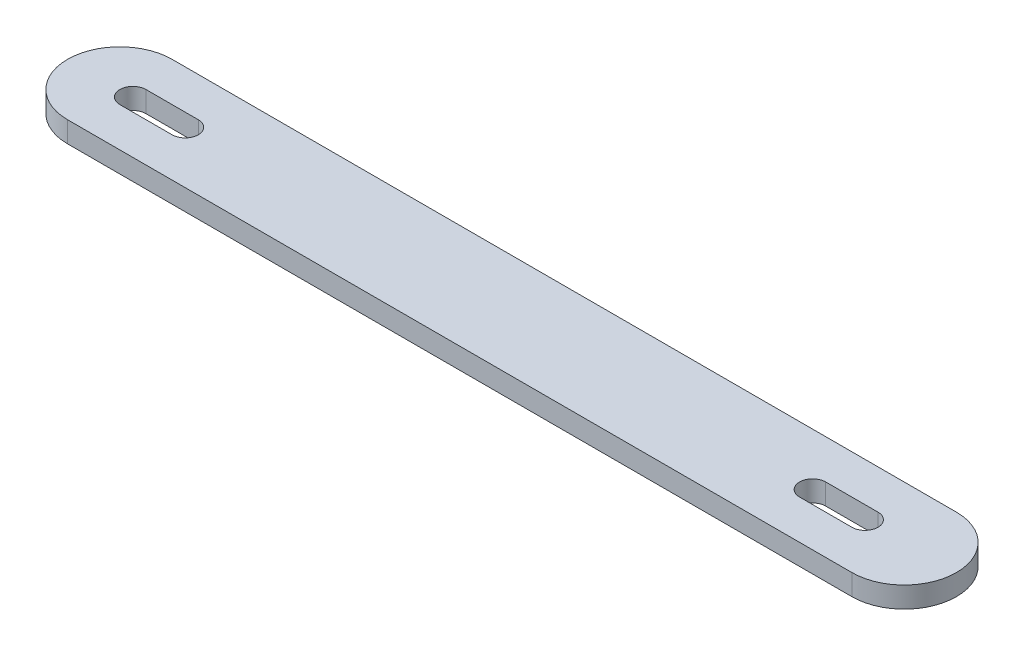
ISO-10303-21;
HEADER;
FILE_DESCRIPTION(('STEP AP214'),'2;1');
FILE_NAME('part.step','',(''),(''),'','','');
FILE_SCHEMA(('AUTOMOTIVE_DESIGN { 1 0 10303 214 1 1 1 1 }'));
ENDSEC;
DATA;
#1=APPLICATION_CONTEXT('core data for automotive mechanical design processes');
#2=APPLICATION_PROTOCOL_DEFINITION('international standard','automotive_design',2000,#1);
#3=PRODUCT_CONTEXT('',#1,'mechanical');
#4=PRODUCT('Part','Part','',(#3));
#5=PRODUCT_RELATED_PRODUCT_CATEGORY('part','',(#4));
#6=PRODUCT_DEFINITION_FORMATION('','',#4);
#7=PRODUCT_DEFINITION_CONTEXT('part definition',#1,'design');
#8=PRODUCT_DEFINITION('design','',#6,#7);
#9=PRODUCT_DEFINITION_SHAPE('','',#8);
#10=(LENGTH_UNIT() NAMED_UNIT(*) SI_UNIT(.MILLI.,.METRE.));
#11=(NAMED_UNIT(*) PLANE_ANGLE_UNIT() SI_UNIT($,.RADIAN.));
#12=(NAMED_UNIT(*) SI_UNIT($,.STERADIAN.) SOLID_ANGLE_UNIT());
#13=UNCERTAINTY_MEASURE_WITH_UNIT(LENGTH_MEASURE(1.E-05),#10,'distance_accuracy_value','');
#14=(GEOMETRIC_REPRESENTATION_CONTEXT(3) GLOBAL_UNCERTAINTY_ASSIGNED_CONTEXT((#13)) GLOBAL_UNIT_ASSIGNED_CONTEXT((#10,
#11,#12)) REPRESENTATION_CONTEXT('',''));
#15=CARTESIAN_POINT('',(0.,0.,0.));
#16=DIRECTION('',(0.,0.,1.));
#17=DIRECTION('',(1.,0.,0.));
#18=AXIS2_PLACEMENT_3D('',#15,#16,#17);
#19=CARTESIAN_POINT('',(-75.,4.,0.));
#20=DIRECTION('',(0.,1.,0.));
#21=DIRECTION('',(0.,0.,1.));
#22=AXIS2_PLACEMENT_3D('',#19,#20,#21);
#23=PLANE('',#22);
#24=CARTESIAN_POINT('',(-75.,4.,0.));
#25=DIRECTION('',(0.,1.,0.));
#26=DIRECTION('',(0.,0.,1.));
#27=AXIS2_PLACEMENT_3D('',#24,#25,#26);
#28=CIRCLE('',#27,9.99999999999999);
#29=CARTESIAN_POINT('',(-75.,4.,-9.99999999999999));
#30=VERTEX_POINT('',#29);
#31=CARTESIAN_POINT('',(-75.,4.,9.99999999999999));
#32=VERTEX_POINT('',#31);
#33=EDGE_CURVE('E220',#30,#32,#28,.T.);
#34=ORIENTED_EDGE('',*,*,#33,.T.);
#35=DIRECTION('',(1.,0.,0.));
#36=VECTOR('',#35,1.);
#37=CARTESIAN_POINT('',(-75.,4.,9.99999999999999));
#38=LINE('',#37,#36);
#39=CARTESIAN_POINT('',(75.,4.,10.));
#40=VERTEX_POINT('',#39);
#41=EDGE_CURVE('E224',#32,#40,#38,.T.);
#42=ORIENTED_EDGE('',*,*,#41,.T.);
#43=CARTESIAN_POINT('',(75.,4.,0.));
#44=DIRECTION('',(0.,1.,0.));
#45=DIRECTION('',(0.,0.,1.));
#46=AXIS2_PLACEMENT_3D('',#43,#44,#45);
#47=CIRCLE('',#46,9.99999999999999);
#48=CARTESIAN_POINT('',(75.,4.,-9.99999999999999));
#49=VERTEX_POINT('',#48);
#50=EDGE_CURVE('E228',#40,#49,#47,.T.);
#51=ORIENTED_EDGE('',*,*,#50,.T.);
#52=DIRECTION('',(-1.,0.,0.));
#53=VECTOR('',#52,1.);
#54=CARTESIAN_POINT('',(-75.,4.,-9.99999999999999));
#55=LINE('',#54,#53);
#56=EDGE_CURVE('E231',#49,#30,#55,.T.);
#57=ORIENTED_EDGE('',*,*,#56,.T.);
#58=EDGE_LOOP('',(#34,#42,#51,#57));
#59=FACE_BOUND('',#58,.T.);
#60=DIRECTION('',(1.,0.,0.));
#61=VECTOR('',#60,1.);
#62=CARTESIAN_POINT('',(-72.5,4.,2.5));
#63=LINE('',#62,#61);
#64=CARTESIAN_POINT('',(-72.5,4.,2.5));
#65=VERTEX_POINT('',#64);
#66=CARTESIAN_POINT('',(-62.5,4.,2.5));
#67=VERTEX_POINT('',#66);
#68=EDGE_CURVE('E180',#65,#67,#63,.T.);
#69=ORIENTED_EDGE('',*,*,#68,.F.);
#70=CARTESIAN_POINT('',(-72.5,4.,0.));
#71=DIRECTION('',(0.,1.,0.));
#72=DIRECTION('',(0.,0.,1.));
#73=AXIS2_PLACEMENT_3D('',#70,#71,#72);
#74=CIRCLE('',#73,2.5);
#75=CARTESIAN_POINT('',(-72.5,4.,-2.5));
#76=VERTEX_POINT('',#75);
#77=EDGE_CURVE('E177',#76,#65,#74,.T.);
#78=ORIENTED_EDGE('',*,*,#77,.F.);
#79=DIRECTION('',(-1.,0.,0.));
#80=VECTOR('',#79,1.);
#81=CARTESIAN_POINT('',(-72.5,4.,-2.5));
#82=LINE('',#81,#80);
#83=CARTESIAN_POINT('',(-62.5,4.,-2.5));
#84=VERTEX_POINT('',#83);
#85=EDGE_CURVE('E188',#84,#76,#82,.T.);
#86=ORIENTED_EDGE('',*,*,#85,.F.);
#87=CARTESIAN_POINT('',(-62.5,4.,0.));
#88=DIRECTION('',(0.,1.,0.));
#89=DIRECTION('',(0.,0.,1.));
#90=AXIS2_PLACEMENT_3D('',#87,#88,#89);
#91=CIRCLE('',#90,2.5);
#92=EDGE_CURVE('E184',#67,#84,#91,.T.);
#93=ORIENTED_EDGE('',*,*,#92,.F.);
#94=EDGE_LOOP('',(#69,#78,#86,#93));
#95=FACE_BOUND('',#94,.T.);
#96=DIRECTION('',(-1.,0.,0.));
#97=VECTOR('',#96,1.);
#98=CARTESIAN_POINT('',(67.5,4.,-2.49999999999999));
#99=LINE('',#98,#97);
#100=CARTESIAN_POINT('',(67.5,4.,-2.49999999999999));
#101=VERTEX_POINT('',#100);
#102=CARTESIAN_POINT('',(57.5,4.,-2.49999999999999));
#103=VERTEX_POINT('',#102);
#104=EDGE_CURVE('E138',#101,#103,#99,.T.);
#105=ORIENTED_EDGE('',*,*,#104,.F.);
#106=CARTESIAN_POINT('',(67.5,4.,0.));
#107=DIRECTION('',(0.,1.,0.));
#108=DIRECTION('',(0.,0.,1.));
#109=AXIS2_PLACEMENT_3D('',#106,#107,#108);
#110=CIRCLE('',#109,2.5);
#111=CARTESIAN_POINT('',(67.5,4.,2.50000000000002));
#112=VERTEX_POINT('',#111);
#113=EDGE_CURVE('E129',#112,#101,#110,.T.);
#114=ORIENTED_EDGE('',*,*,#113,.F.);
#115=DIRECTION('',(1.,0.,0.));
#116=VECTOR('',#115,1.);
#117=CARTESIAN_POINT('',(67.5,4.,2.50000000000002));
#118=LINE('',#117,#116);
#119=CARTESIAN_POINT('',(57.5,4.,2.50000000000002));
#120=VERTEX_POINT('',#119);
#121=EDGE_CURVE('E155',#120,#112,#118,.T.);
#122=ORIENTED_EDGE('',*,*,#121,.F.);
#123=CARTESIAN_POINT('',(57.5,4.,0.));
#124=DIRECTION('',(0.,1.,0.));
#125=DIRECTION('',(0.,0.,1.));
#126=AXIS2_PLACEMENT_3D('',#123,#124,#125);
#127=CIRCLE('',#126,2.5);
#128=EDGE_CURVE('E151',#103,#120,#127,.T.);
#129=ORIENTED_EDGE('',*,*,#128,.F.);
#130=EDGE_LOOP('',(#105,#114,#122,#129));
#131=FACE_BOUND('',#130,.T.);
#132=ADVANCED_FACE('F39',(#59,#95,#131),#23,.T.);
#133=CARTESIAN_POINT('',(-75.,0.,0.));
#134=DIRECTION('',(0.,1.,0.));
#135=DIRECTION('',(0.,0.,1.));
#136=AXIS2_PLACEMENT_3D('',#133,#134,#135);
#137=PLANE('',#136);
#138=CARTESIAN_POINT('',(-72.5,0.,0.));
#139=DIRECTION('',(0.,1.,0.));
#140=DIRECTION('',(0.,0.,1.));
#141=AXIS2_PLACEMENT_3D('',#138,#139,#140);
#142=CIRCLE('',#141,2.5);
#143=CARTESIAN_POINT('',(-72.5,0.,-2.5));
#144=VERTEX_POINT('',#143);
#145=CARTESIAN_POINT('',(-72.5,0.,2.5));
#146=VERTEX_POINT('',#145);
#147=EDGE_CURVE('E147',#144,#146,#142,.T.);
#148=ORIENTED_EDGE('',*,*,#147,.T.);
#149=DIRECTION('',(1.,0.,0.));
#150=VECTOR('',#149,1.);
#151=CARTESIAN_POINT('',(-72.5,0.,2.5));
#152=LINE('',#151,#150);
#153=CARTESIAN_POINT('',(-62.5,0.,2.5));
#154=VERTEX_POINT('',#153);
#155=EDGE_CURVE('E195',#146,#154,#152,.T.);
#156=ORIENTED_EDGE('',*,*,#155,.T.);
#157=CARTESIAN_POINT('',(-62.5,0.,0.));
#158=DIRECTION('',(0.,1.,0.));
#159=DIRECTION('',(0.,0.,1.));
#160=AXIS2_PLACEMENT_3D('',#157,#158,#159);
#161=CIRCLE('',#160,2.5);
#162=CARTESIAN_POINT('',(-62.5,0.,-2.5));
#163=VERTEX_POINT('',#162);
#164=EDGE_CURVE('E199',#154,#163,#161,.T.);
#165=ORIENTED_EDGE('',*,*,#164,.T.);
#166=DIRECTION('',(-1.,0.,0.));
#167=VECTOR('',#166,1.);
#168=CARTESIAN_POINT('',(-72.5,0.,-2.5));
#169=LINE('',#168,#167);
#170=EDGE_CURVE('E181',#163,#144,#169,.T.);
#171=ORIENTED_EDGE('',*,*,#170,.T.);
#172=EDGE_LOOP('',(#148,#156,#165,#171));
#173=FACE_BOUND('',#172,.T.);
#174=CARTESIAN_POINT('',(-75.,0.,0.));
#175=DIRECTION('',(0.,1.,0.));
#176=DIRECTION('',(0.,0.,1.));
#177=AXIS2_PLACEMENT_3D('',#174,#175,#176);
#178=CIRCLE('',#177,9.99999999999999);
#179=CARTESIAN_POINT('',(-75.,0.,-9.99999999999999));
#180=VERTEX_POINT('',#179);
#181=CARTESIAN_POINT('',(-75.,0.,9.99999999999999));
#182=VERTEX_POINT('',#181);
#183=EDGE_CURVE('E219',#180,#182,#178,.T.);
#184=ORIENTED_EDGE('',*,*,#183,.F.);
#185=DIRECTION('',(-1.,0.,0.));
#186=VECTOR('',#185,1.);
#187=CARTESIAN_POINT('',(-75.,0.,-9.99999999999999));
#188=LINE('',#187,#186);
#189=CARTESIAN_POINT('',(75.,0.,-9.99999999999999));
#190=VERTEX_POINT('',#189);
#191=EDGE_CURVE('E225',#190,#180,#188,.T.);
#192=ORIENTED_EDGE('',*,*,#191,.F.);
#193=CARTESIAN_POINT('',(75.,0.,0.));
#194=DIRECTION('',(0.,1.,0.));
#195=DIRECTION('',(0.,0.,1.));
#196=AXIS2_PLACEMENT_3D('',#193,#194,#195);
#197=CIRCLE('',#196,9.99999999999999);
#198=CARTESIAN_POINT('',(75.,0.,10.));
#199=VERTEX_POINT('',#198);
#200=EDGE_CURVE('E241',#199,#190,#197,.T.);
#201=ORIENTED_EDGE('',*,*,#200,.F.);
#202=DIRECTION('',(1.,0.,0.));
#203=VECTOR('',#202,1.);
#204=CARTESIAN_POINT('',(-75.,0.,9.99999999999999));
#205=LINE('',#204,#203);
#206=EDGE_CURVE('E238',#182,#199,#205,.T.);
#207=ORIENTED_EDGE('',*,*,#206,.F.);
#208=EDGE_LOOP('',(#184,#192,#201,#207));
#209=FACE_BOUND('',#208,.T.);
#210=CARTESIAN_POINT('',(67.5,0.,0.));
#211=DIRECTION('',(0.,1.,0.));
#212=DIRECTION('',(0.,0.,1.));
#213=AXIS2_PLACEMENT_3D('',#210,#211,#212);
#214=CIRCLE('',#213,2.5);
#215=CARTESIAN_POINT('',(67.5,0.,2.50000000000002));
#216=VERTEX_POINT('',#215);
#217=CARTESIAN_POINT('',(67.5,0.,-2.49999999999999));
#218=VERTEX_POINT('',#217);
#219=EDGE_CURVE('E63',#216,#218,#214,.T.);
#220=ORIENTED_EDGE('',*,*,#219,.T.);
#221=DIRECTION('',(-1.,0.,0.));
#222=VECTOR('',#221,1.);
#223=CARTESIAN_POINT('',(67.5,0.,-2.49999999999999));
#224=LINE('',#223,#222);
#225=CARTESIAN_POINT('',(57.5,0.,-2.49999999999999));
#226=VERTEX_POINT('',#225);
#227=EDGE_CURVE('E145',#218,#226,#224,.T.);
#228=ORIENTED_EDGE('',*,*,#227,.T.);
#229=CARTESIAN_POINT('',(57.5,0.,0.));
#230=DIRECTION('',(0.,1.,0.));
#231=DIRECTION('',(0.,0.,1.));
#232=AXIS2_PLACEMENT_3D('',#229,#230,#231);
#233=CIRCLE('',#232,2.5);
#234=CARTESIAN_POINT('',(57.5,0.,2.50000000000002));
#235=VERTEX_POINT('',#234);
#236=EDGE_CURVE('E164',#226,#235,#233,.T.);
#237=ORIENTED_EDGE('',*,*,#236,.T.);
#238=DIRECTION('',(1.,0.,0.));
#239=VECTOR('',#238,1.);
#240=CARTESIAN_POINT('',(67.5,0.,2.50000000000002));
#241=LINE('',#240,#239);
#242=EDGE_CURVE('E139',#235,#216,#241,.T.);
#243=ORIENTED_EDGE('',*,*,#242,.T.);
#244=EDGE_LOOP('',(#220,#228,#237,#243));
#245=FACE_BOUND('',#244,.T.);
#246=ADVANCED_FACE('F264',(#173,#209,#245),#137,.F.);
#247=CARTESIAN_POINT('',(-75.,4.,0.));
#248=DIRECTION('',(0.,-1.,0.));
#249=DIRECTION('',(0.,0.,-1.));
#250=AXIS2_PLACEMENT_3D('',#247,#248,#249);
#251=CYLINDRICAL_SURFACE('',#250,9.99999999999999);
#252=ORIENTED_EDGE('',*,*,#183,.T.);
#253=DIRECTION('',(0.,-1.,0.));
#254=VECTOR('',#253,1.);
#255=CARTESIAN_POINT('',(-75.,4.,9.99999999999999));
#256=LINE('',#255,#254);
#257=EDGE_CURVE('E11',#32,#182,#256,.T.);
#258=ORIENTED_EDGE('',*,*,#257,.F.);
#259=ORIENTED_EDGE('',*,*,#33,.F.);
#260=DIRECTION('',(0.,-1.,0.));
#261=VECTOR('',#260,1.);
#262=CARTESIAN_POINT('',(-75.,4.,-9.99999999999999));
#263=LINE('',#262,#261);
#264=EDGE_CURVE('E234',#30,#180,#263,.T.);
#265=ORIENTED_EDGE('',*,*,#264,.T.);
#266=EDGE_LOOP('',(#252,#258,#259,#265));
#267=FACE_BOUND('',#266,.T.);
#268=ADVANCED_FACE('F41',(#267),#251,.T.);
#269=CARTESIAN_POINT('',(-75.,4.,9.99999999999999));
#270=DIRECTION('',(0.,0.,-1.));
#271=DIRECTION('',(-1.,0.,0.));
#272=AXIS2_PLACEMENT_3D('',#269,#270,#271);
#273=PLANE('',#272);
#274=ORIENTED_EDGE('',*,*,#206,.T.);
#275=DIRECTION('',(0.,-1.,0.));
#276=VECTOR('',#275,1.);
#277=CARTESIAN_POINT('',(75.,4.,10.));
#278=LINE('',#277,#276);
#279=EDGE_CURVE('E48',#40,#199,#278,.T.);
#280=ORIENTED_EDGE('',*,*,#279,.F.);
#281=ORIENTED_EDGE('',*,*,#41,.F.);
#282=ORIENTED_EDGE('',*,*,#257,.T.);
#283=EDGE_LOOP('',(#274,#280,#281,#282));
#284=FACE_BOUND('',#283,.T.);
#285=ADVANCED_FACE('F275',(#284),#273,.F.);
#286=CARTESIAN_POINT('',(75.,4.,0.));
#287=DIRECTION('',(0.,-1.,0.));
#288=DIRECTION('',(0.,0.,-1.));
#289=AXIS2_PLACEMENT_3D('',#286,#287,#288);
#290=CYLINDRICAL_SURFACE('',#289,9.99999999999999);
#291=ORIENTED_EDGE('',*,*,#200,.T.);
#292=DIRECTION('',(0.,-1.,0.));
#293=VECTOR('',#292,1.);
#294=CARTESIAN_POINT('',(75.,4.,-9.99999999999999));
#295=LINE('',#294,#293);
#296=EDGE_CURVE('E249',#49,#190,#295,.T.);
#297=ORIENTED_EDGE('',*,*,#296,.F.);
#298=ORIENTED_EDGE('',*,*,#50,.F.);
#299=ORIENTED_EDGE('',*,*,#279,.T.);
#300=EDGE_LOOP('',(#291,#297,#298,#299));
#301=FACE_BOUND('',#300,.T.);
#302=ADVANCED_FACE('F258',(#301),#290,.T.);
#303=CARTESIAN_POINT('',(-75.,4.,-9.99999999999999));
#304=DIRECTION('',(0.,0.,1.));
#305=DIRECTION('',(1.,0.,0.));
#306=AXIS2_PLACEMENT_3D('',#303,#304,#305);
#307=PLANE('',#306);
#308=ORIENTED_EDGE('',*,*,#191,.T.);
#309=ORIENTED_EDGE('',*,*,#264,.F.);
#310=ORIENTED_EDGE('',*,*,#56,.F.);
#311=ORIENTED_EDGE('',*,*,#296,.T.);
#312=EDGE_LOOP('',(#308,#309,#310,#311));
#313=FACE_BOUND('',#312,.T.);
#314=ADVANCED_FACE('F268',(#313),#307,.F.);
#315=CARTESIAN_POINT('',(-72.5,4.,0.));
#316=DIRECTION('',(0.,-1.,0.));
#317=DIRECTION('',(0.,0.,-1.));
#318=AXIS2_PLACEMENT_3D('',#315,#316,#317);
#319=CYLINDRICAL_SURFACE('',#318,2.5);
#320=ORIENTED_EDGE('',*,*,#147,.F.);
#321=DIRECTION('',(0.,-1.,0.));
#322=VECTOR('',#321,1.);
#323=CARTESIAN_POINT('',(-72.5,4.,-2.5));
#324=LINE('',#323,#322);
#325=EDGE_CURVE('E191',#76,#144,#324,.T.);
#326=ORIENTED_EDGE('',*,*,#325,.F.);
#327=ORIENTED_EDGE('',*,*,#77,.T.);
#328=DIRECTION('',(0.,-1.,0.));
#329=VECTOR('',#328,1.);
#330=CARTESIAN_POINT('',(-72.5,4.,2.5));
#331=LINE('',#330,#329);
#332=EDGE_CURVE('E215',#65,#146,#331,.T.);
#333=ORIENTED_EDGE('',*,*,#332,.T.);
#334=EDGE_LOOP('',(#320,#326,#327,#333));
#335=FACE_BOUND('',#334,.T.);
#336=ADVANCED_FACE('F290',(#335),#319,.F.);
#337=CARTESIAN_POINT('',(-72.5,4.,2.5));
#338=DIRECTION('',(0.,0.,-1.));
#339=DIRECTION('',(-1.,0.,0.));
#340=AXIS2_PLACEMENT_3D('',#337,#338,#339);
#341=PLANE('',#340);
#342=ORIENTED_EDGE('',*,*,#155,.F.);
#343=ORIENTED_EDGE('',*,*,#332,.F.);
#344=ORIENTED_EDGE('',*,*,#68,.T.);
#345=DIRECTION('',(0.,-1.,0.));
#346=VECTOR('',#345,1.);
#347=CARTESIAN_POINT('',(-62.5,4.,2.5));
#348=LINE('',#347,#346);
#349=EDGE_CURVE('E212',#67,#154,#348,.T.);
#350=ORIENTED_EDGE('',*,*,#349,.T.);
#351=EDGE_LOOP('',(#342,#343,#344,#350));
#352=FACE_BOUND('',#351,.T.);
#353=ADVANCED_FACE('F297',(#352),#341,.T.);
#354=CARTESIAN_POINT('',(-62.5,4.,0.));
#355=DIRECTION('',(0.,-1.,0.));
#356=DIRECTION('',(0.,0.,-1.));
#357=AXIS2_PLACEMENT_3D('',#354,#355,#356);
#358=CYLINDRICAL_SURFACE('',#357,2.5);
#359=ORIENTED_EDGE('',*,*,#164,.F.);
#360=ORIENTED_EDGE('',*,*,#349,.F.);
#361=ORIENTED_EDGE('',*,*,#92,.T.);
#362=DIRECTION('',(0.,-1.,0.));
#363=VECTOR('',#362,1.);
#364=CARTESIAN_POINT('',(-62.5,4.,-2.5));
#365=LINE('',#364,#363);
#366=EDGE_CURVE('E209',#84,#163,#365,.T.);
#367=ORIENTED_EDGE('',*,*,#366,.T.);
#368=EDGE_LOOP('',(#359,#360,#361,#367));
#369=FACE_BOUND('',#368,.T.);
#370=ADVANCED_FACE('F302',(#369),#358,.F.);
#371=CARTESIAN_POINT('',(-72.5,4.,-2.5));
#372=DIRECTION('',(0.,0.,1.));
#373=DIRECTION('',(1.,0.,0.));
#374=AXIS2_PLACEMENT_3D('',#371,#372,#373);
#375=PLANE('',#374);
#376=ORIENTED_EDGE('',*,*,#170,.F.);
#377=ORIENTED_EDGE('',*,*,#366,.F.);
#378=ORIENTED_EDGE('',*,*,#85,.T.);
#379=ORIENTED_EDGE('',*,*,#325,.T.);
#380=EDGE_LOOP('',(#376,#377,#378,#379));
#381=FACE_BOUND('',#380,.T.);
#382=ADVANCED_FACE('F309',(#381),#375,.T.);
#383=CARTESIAN_POINT('',(67.5,4.,0.));
#384=DIRECTION('',(0.,-1.,0.));
#385=DIRECTION('',(0.,0.,-1.));
#386=AXIS2_PLACEMENT_3D('',#383,#384,#385);
#387=CYLINDRICAL_SURFACE('',#386,2.5);
#388=ORIENTED_EDGE('',*,*,#219,.F.);
#389=DIRECTION('',(0.,-1.,0.));
#390=VECTOR('',#389,1.);
#391=CARTESIAN_POINT('',(67.5,4.,2.50000000000002));
#392=LINE('',#391,#390);
#393=EDGE_CURVE('E133',#112,#216,#392,.T.);
#394=ORIENTED_EDGE('',*,*,#393,.F.);
#395=ORIENTED_EDGE('',*,*,#113,.T.);
#396=DIRECTION('',(0.,-1.,0.));
#397=VECTOR('',#396,1.);
#398=CARTESIAN_POINT('',(67.5,4.,-2.49999999999999));
#399=LINE('',#398,#397);
#400=EDGE_CURVE('E132',#101,#218,#399,.T.);
#401=ORIENTED_EDGE('',*,*,#400,.T.);
#402=EDGE_LOOP('',(#388,#394,#395,#401));
#403=FACE_BOUND('',#402,.T.);
#404=ADVANCED_FACE('F131',(#403),#387,.F.);
#405=CARTESIAN_POINT('',(67.5,4.,-2.49999999999999));
#406=DIRECTION('',(0.,0.,1.));
#407=DIRECTION('',(1.,0.,0.));
#408=AXIS2_PLACEMENT_3D('',#405,#406,#407);
#409=PLANE('',#408);
#410=ORIENTED_EDGE('',*,*,#227,.F.);
#411=ORIENTED_EDGE('',*,*,#400,.F.);
#412=ORIENTED_EDGE('',*,*,#104,.T.);
#413=DIRECTION('',(0.,-1.,0.));
#414=VECTOR('',#413,1.);
#415=CARTESIAN_POINT('',(57.5,4.,-2.49999999999999));
#416=LINE('',#415,#414);
#417=EDGE_CURVE('E148',#103,#226,#416,.T.);
#418=ORIENTED_EDGE('',*,*,#417,.T.);
#419=EDGE_LOOP('',(#410,#411,#412,#418));
#420=FACE_BOUND('',#419,.T.);
#421=ADVANCED_FACE('F142',(#420),#409,.T.);
#422=CARTESIAN_POINT('',(57.5,4.,0.));
#423=DIRECTION('',(0.,-1.,0.));
#424=DIRECTION('',(0.,0.,-1.));
#425=AXIS2_PLACEMENT_3D('',#422,#423,#424);
#426=CYLINDRICAL_SURFACE('',#425,2.5);
#427=ORIENTED_EDGE('',*,*,#236,.F.);
#428=ORIENTED_EDGE('',*,*,#417,.F.);
#429=ORIENTED_EDGE('',*,*,#128,.T.);
#430=DIRECTION('',(0.,-1.,0.));
#431=VECTOR('',#430,1.);
#432=CARTESIAN_POINT('',(57.5,4.,2.50000000000002));
#433=LINE('',#432,#431);
#434=EDGE_CURVE('E55',#120,#235,#433,.T.);
#435=ORIENTED_EDGE('',*,*,#434,.T.);
#436=EDGE_LOOP('',(#427,#428,#429,#435));
#437=FACE_BOUND('',#436,.T.);
#438=ADVANCED_FACE('F327',(#437),#426,.F.);
#439=CARTESIAN_POINT('',(67.5,4.,2.50000000000002));
#440=DIRECTION('',(0.,0.,-1.));
#441=DIRECTION('',(-1.,0.,0.));
#442=AXIS2_PLACEMENT_3D('',#439,#440,#441);
#443=PLANE('',#442);
#444=ORIENTED_EDGE('',*,*,#242,.F.);
#445=ORIENTED_EDGE('',*,*,#434,.F.);
#446=ORIENTED_EDGE('',*,*,#121,.T.);
#447=ORIENTED_EDGE('',*,*,#393,.T.);
#448=EDGE_LOOP('',(#444,#445,#446,#447));
#449=FACE_BOUND('',#448,.T.);
#450=ADVANCED_FACE('F330',(#449),#443,.T.);
#451=CLOSED_SHELL('',(#132,#246,#268,#285,#302,#314,#336,#353,#370,#382,#404,#421,#438,#450));
#452=MANIFOLD_SOLID_BREP('B2',#451);
#453=ADVANCED_BREP_SHAPE_REPRESENTATION('',(#18,#452),#14);
#454=SHAPE_DEFINITION_REPRESENTATION(#9,#453);
ENDSEC;
END-ISO-10303-21;
